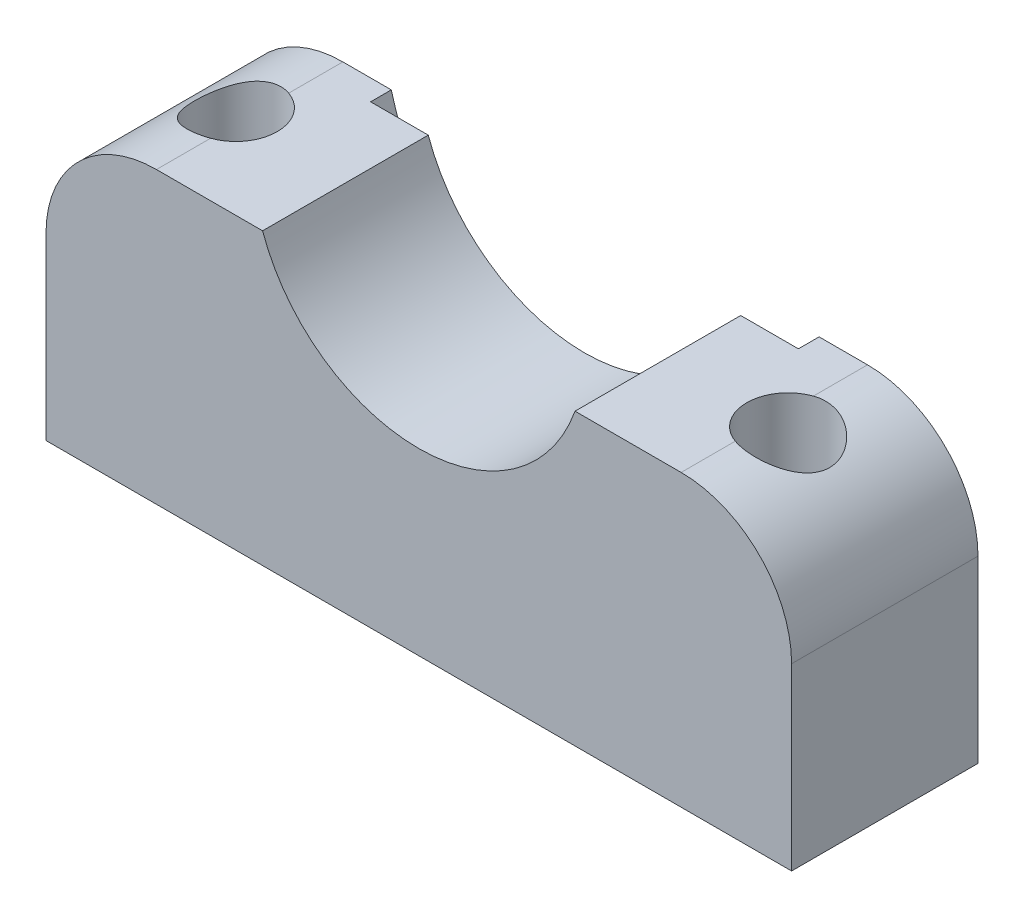
ISO-10303-21;
HEADER;
FILE_DESCRIPTION(('STEP AP214'),'2;1');
FILE_NAME('part.step','',(''),(''),'','','');
FILE_SCHEMA(('AUTOMOTIVE_DESIGN { 1 0 10303 214 1 1 1 1 }'));
ENDSEC;
DATA;
#1=APPLICATION_CONTEXT('core data for automotive mechanical design processes');
#2=APPLICATION_PROTOCOL_DEFINITION('international standard','automotive_design',2000,#1);
#3=PRODUCT_CONTEXT('',#1,'mechanical');
#4=PRODUCT('Part','Part','',(#3));
#5=PRODUCT_RELATED_PRODUCT_CATEGORY('part','',(#4));
#6=PRODUCT_DEFINITION_FORMATION('','',#4);
#7=PRODUCT_DEFINITION_CONTEXT('part definition',#1,'design');
#8=PRODUCT_DEFINITION('design','',#6,#7);
#9=PRODUCT_DEFINITION_SHAPE('','',#8);
#10=(LENGTH_UNIT() NAMED_UNIT(*) SI_UNIT(.MILLI.,.METRE.));
#11=(NAMED_UNIT(*) PLANE_ANGLE_UNIT() SI_UNIT($,.RADIAN.));
#12=(NAMED_UNIT(*) SI_UNIT($,.STERADIAN.) SOLID_ANGLE_UNIT());
#13=UNCERTAINTY_MEASURE_WITH_UNIT(LENGTH_MEASURE(1.E-05),#10,'distance_accuracy_value','');
#14=(GEOMETRIC_REPRESENTATION_CONTEXT(3) GLOBAL_UNCERTAINTY_ASSIGNED_CONTEXT((#13)) GLOBAL_UNIT_ASSIGNED_CONTEXT((#10,
#11,#12)) REPRESENTATION_CONTEXT('',''));
#15=CARTESIAN_POINT('',(0.,0.,0.));
#16=DIRECTION('',(0.,0.,1.));
#17=DIRECTION('',(1.,0.,0.));
#18=AXIS2_PLACEMENT_3D('',#15,#16,#17);
#19=CARTESIAN_POINT('',(-13.5,12.5,6.75));
#20=DIRECTION('',(0.,0.,-1.));
#21=DIRECTION('',(-1.,0.,0.));
#22=AXIS2_PLACEMENT_3D('',#19,#20,#21);
#23=CYLINDRICAL_SURFACE('',#22,6.);
#24=DIRECTION('',(0.,0.,-1.));
#25=VECTOR('',#24,1.);
#26=CARTESIAN_POINT('',(-19.1568542494924,10.5,6.75));
#27=LINE('',#26,#25);
#28=CARTESIAN_POINT('',(-19.1568542494924,10.5,6.75));
#29=VERTEX_POINT('',#28);
#30=CARTESIAN_POINT('',(-19.1568542494924,10.5,0.75));
#31=VERTEX_POINT('',#30);
#32=EDGE_CURVE('E131',#29,#31,#27,.T.);
#33=ORIENTED_EDGE('',*,*,#32,.F.);
#34=CARTESIAN_POINT('',(-13.5,12.5,6.75));
#35=DIRECTION('',(0.,0.,1.));
#36=DIRECTION('',(1.,0.,0.));
#37=AXIS2_PLACEMENT_3D('',#34,#35,#36);
#38=CIRCLE('',#37,6.);
#39=CARTESIAN_POINT('',(-7.84314575050762,10.5,6.75));
#40=VERTEX_POINT('',#39);
#41=EDGE_CURVE('E146',#29,#40,#38,.T.);
#42=ORIENTED_EDGE('',*,*,#41,.T.);
#43=DIRECTION('',(0.,0.,-1.));
#44=VECTOR('',#43,1.);
#45=CARTESIAN_POINT('',(-7.84314575050762,10.5,6.75));
#46=LINE('',#45,#44);
#47=CARTESIAN_POINT('',(-7.84314575050762,10.5,0.75));
#48=VERTEX_POINT('',#47);
#49=EDGE_CURVE('E356',#48,#40,#46,.F.);
#50=ORIENTED_EDGE('',*,*,#49,.F.);
#51=CARTESIAN_POINT('',(-13.5,12.5,0.75));
#52=DIRECTION('',(0.,0.,-1.));
#53=DIRECTION('',(-1.,0.,0.));
#54=AXIS2_PLACEMENT_3D('',#51,#52,#53);
#55=CIRCLE('',#54,6.);
#56=EDGE_CURVE('E148',#48,#31,#55,.T.);
#57=ORIENTED_EDGE('',*,*,#56,.T.);
#58=EDGE_LOOP('',(#33,#42,#50,#57));
#59=FACE_BOUND('',#58,.T.);
#60=ADVANCED_FACE('F35',(#59),#23,.F.);
#61=CARTESIAN_POINT('',(-27.,0.,6.75));
#62=DIRECTION('',(-1.,0.,0.));
#63=DIRECTION('',(0.,-1.,0.));
#64=AXIS2_PLACEMENT_3D('',#61,#62,#63);
#65=PLANE('',#64);
#66=DIRECTION('',(0.,1.,0.));
#67=VECTOR('',#66,1.);
#68=CARTESIAN_POINT('',(-27.,0.,6.75));
#69=LINE('',#68,#67);
#70=CARTESIAN_POINT('',(-27.,0.,6.75));
#71=VERTEX_POINT('',#70);
#72=CARTESIAN_POINT('',(-27.,6.5,6.75));
#73=VERTEX_POINT('',#72);
#74=EDGE_CURVE('E154',#71,#73,#69,.T.);
#75=ORIENTED_EDGE('',*,*,#74,.T.);
#76=DIRECTION('',(0.,0.,1.));
#77=VECTOR('',#76,1.);
#78=CARTESIAN_POINT('',(-27.,6.5,0.));
#79=LINE('',#78,#77);
#80=CARTESIAN_POINT('',(-27.,6.5,0.));
#81=VERTEX_POINT('',#80);
#82=EDGE_CURVE('E351',#73,#81,#79,.F.);
#83=ORIENTED_EDGE('',*,*,#82,.T.);
#84=DIRECTION('',(0.,1.,0.));
#85=VECTOR('',#84,1.);
#86=CARTESIAN_POINT('',(-27.,0.,0.));
#87=LINE('',#86,#85);
#88=CARTESIAN_POINT('',(-27.,0.,0.));
#89=VERTEX_POINT('',#88);
#90=EDGE_CURVE('E172',#89,#81,#87,.T.);
#91=ORIENTED_EDGE('',*,*,#90,.F.);
#92=DIRECTION('',(0.,0.,-1.));
#93=VECTOR('',#92,1.);
#94=CARTESIAN_POINT('',(-27.,0.,6.75));
#95=LINE('',#94,#93);
#96=EDGE_CURVE('E178',#71,#89,#95,.T.);
#97=ORIENTED_EDGE('',*,*,#96,.F.);
#98=EDGE_LOOP('',(#75,#83,#91,#97));
#99=FACE_BOUND('',#98,.T.);
#100=ADVANCED_FACE('F243',(#99),#65,.T.);
#101=CARTESIAN_POINT('',(0.,0.,6.75));
#102=DIRECTION('',(0.,-1.,0.));
#103=DIRECTION('',(1.,0.,0.));
#104=AXIS2_PLACEMENT_3D('',#101,#102,#103);
#105=PLANE('',#104);
#106=CARTESIAN_POINT('',(-23.5,0.,3.375));
#107=DIRECTION('',(0.,-1.,0.));
#108=DIRECTION('',(1.,0.,0.));
#109=AXIS2_PLACEMENT_3D('',#106,#107,#108);
#110=CIRCLE('',#109,1.5);
#111=CARTESIAN_POINT('',(-22.,0.,3.375));
#112=VERTEX_POINT('',#111);
#113=EDGE_CURVE('E192',#112,#112,#110,.T.);
#114=ORIENTED_EDGE('',*,*,#113,.F.);
#115=EDGE_LOOP('',(#114));
#116=FACE_BOUND('',#115,.T.);
#117=CARTESIAN_POINT('',(-3.5,0.,3.375));
#118=DIRECTION('',(0.,-1.,0.));
#119=DIRECTION('',(1.,0.,0.));
#120=AXIS2_PLACEMENT_3D('',#117,#118,#119);
#121=CIRCLE('',#120,1.5);
#122=CARTESIAN_POINT('',(-2.,0.,3.375));
#123=VERTEX_POINT('',#122);
#124=EDGE_CURVE('E359',#123,#123,#121,.T.);
#125=ORIENTED_EDGE('',*,*,#124,.F.);
#126=EDGE_LOOP('',(#125));
#127=FACE_BOUND('',#126,.T.);
#128=DIRECTION('',(-1.,0.,0.));
#129=VECTOR('',#128,1.);
#130=CARTESIAN_POINT('',(0.,0.,0.));
#131=LINE('',#130,#129);
#132=CARTESIAN_POINT('',(0.,0.,0.));
#133=VERTEX_POINT('',#132);
#134=EDGE_CURVE('E161',#133,#89,#131,.T.);
#135=ORIENTED_EDGE('',*,*,#134,.F.);
#136=DIRECTION('',(0.,0.,-1.));
#137=VECTOR('',#136,1.);
#138=CARTESIAN_POINT('',(0.,0.,6.75));
#139=LINE('',#138,#137);
#140=CARTESIAN_POINT('',(0.,0.,6.75));
#141=VERTEX_POINT('',#140);
#142=EDGE_CURVE('E171',#141,#133,#139,.T.);
#143=ORIENTED_EDGE('',*,*,#142,.F.);
#144=DIRECTION('',(-1.,0.,0.));
#145=VECTOR('',#144,1.);
#146=CARTESIAN_POINT('',(0.,0.,6.75));
#147=LINE('',#146,#145);
#148=EDGE_CURVE('E158',#141,#71,#147,.T.);
#149=ORIENTED_EDGE('',*,*,#148,.T.);
#150=ORIENTED_EDGE('',*,*,#96,.T.);
#151=EDGE_LOOP('',(#135,#143,#149,#150));
#152=FACE_BOUND('',#151,.T.);
#153=ADVANCED_FACE('F239',(#116,#127,#152),#105,.T.);
#154=CARTESIAN_POINT('',(0.,0.,6.75));
#155=DIRECTION('',(-1.,0.,0.));
#156=DIRECTION('',(0.,0.,1.));
#157=AXIS2_PLACEMENT_3D('',#154,#155,#156);
#158=PLANE('',#157);
#159=DIRECTION('',(0.,1.,0.));
#160=VECTOR('',#159,1.);
#161=CARTESIAN_POINT('',(0.,0.,0.));
#162=LINE('',#161,#160);
#163=CARTESIAN_POINT('',(0.,6.5,0.));
#164=VERTEX_POINT('',#163);
#165=EDGE_CURVE('E155',#133,#164,#162,.T.);
#166=ORIENTED_EDGE('',*,*,#165,.T.);
#167=DIRECTION('',(0.,0.,1.));
#168=VECTOR('',#167,1.);
#169=CARTESIAN_POINT('',(0.,6.5,6.75));
#170=LINE('',#169,#168);
#171=CARTESIAN_POINT('',(0.,6.5,6.75));
#172=VERTEX_POINT('',#171);
#173=EDGE_CURVE('E343',#164,#172,#170,.T.);
#174=ORIENTED_EDGE('',*,*,#173,.T.);
#175=DIRECTION('',(0.,1.,0.));
#176=VECTOR('',#175,1.);
#177=CARTESIAN_POINT('',(0.,0.,6.75));
#178=LINE('',#177,#176);
#179=EDGE_CURVE('E168',#141,#172,#178,.T.);
#180=ORIENTED_EDGE('',*,*,#179,.F.);
#181=ORIENTED_EDGE('',*,*,#142,.T.);
#182=EDGE_LOOP('',(#166,#174,#180,#181));
#183=FACE_BOUND('',#182,.T.);
#184=ADVANCED_FACE('F233',(#183),#158,.F.);
#185=CARTESIAN_POINT('',(0.,0.,6.75));
#186=DIRECTION('',(0.,0.,1.));
#187=DIRECTION('',(1.,0.,0.));
#188=AXIS2_PLACEMENT_3D('',#185,#186,#187);
#189=PLANE('',#188);
#190=DIRECTION('',(1.,0.,0.));
#191=VECTOR('',#190,1.);
#192=CARTESIAN_POINT('',(0.,10.5,6.75));
#193=LINE('',#192,#191);
#194=CARTESIAN_POINT('',(-23.,10.5,6.75));
#195=VERTEX_POINT('',#194);
#196=EDGE_CURVE('E127',#195,#29,#193,.T.);
#197=ORIENTED_EDGE('',*,*,#196,.F.);
#198=CARTESIAN_POINT('',(-23.,6.5,6.75));
#199=DIRECTION('',(0.,0.,1.));
#200=DIRECTION('',(1.,0.,0.));
#201=AXIS2_PLACEMENT_3D('',#198,#199,#200);
#202=CIRCLE('',#201,4.);
#203=EDGE_CURVE('E352',#195,#73,#202,.T.);
#204=ORIENTED_EDGE('',*,*,#203,.T.);
#205=ORIENTED_EDGE('',*,*,#74,.F.);
#206=ORIENTED_EDGE('',*,*,#148,.F.);
#207=ORIENTED_EDGE('',*,*,#179,.T.);
#208=CARTESIAN_POINT('',(-4.,6.5,6.75));
#209=DIRECTION('',(0.,0.,1.));
#210=DIRECTION('',(1.,0.,0.));
#211=AXIS2_PLACEMENT_3D('',#208,#209,#210);
#212=CIRCLE('',#211,4.);
#213=CARTESIAN_POINT('',(-4.,10.5,6.75));
#214=VERTEX_POINT('',#213);
#215=EDGE_CURVE('E205',#172,#214,#212,.T.);
#216=ORIENTED_EDGE('',*,*,#215,.T.);
#217=EDGE_CURVE('E140',#40,#214,#193,.T.);
#218=ORIENTED_EDGE('',*,*,#217,.F.);
#219=ORIENTED_EDGE('',*,*,#41,.F.);
#220=EDGE_LOOP('',(#197,#204,#205,#206,#207,#216,#218,#219));
#221=FACE_BOUND('',#220,.T.);
#222=ADVANCED_FACE('F153',(#221),#189,.T.);
#223=CARTESIAN_POINT('',(0.,0.,0.));
#224=DIRECTION('',(0.,0.,1.));
#225=DIRECTION('',(1.,0.,0.));
#226=AXIS2_PLACEMENT_3D('',#223,#224,#225);
#227=PLANE('',#226);
#228=ORIENTED_EDGE('',*,*,#90,.T.);
#229=CARTESIAN_POINT('',(-23.,6.5,0.));
#230=DIRECTION('',(0.,0.,1.));
#231=DIRECTION('',(1.,0.,0.));
#232=AXIS2_PLACEMENT_3D('',#229,#230,#231);
#233=CIRCLE('',#232,4.);
#234=CARTESIAN_POINT('',(-23.,10.5,0.));
#235=VERTEX_POINT('',#234);
#236=EDGE_CURVE('E346',#81,#235,#233,.F.);
#237=ORIENTED_EDGE('',*,*,#236,.T.);
#238=DIRECTION('',(1.,0.,0.));
#239=VECTOR('',#238,1.);
#240=CARTESIAN_POINT('',(0.,10.5,0.));
#241=LINE('',#240,#239);
#242=CARTESIAN_POINT('',(-21.2459666924148,10.5,0.));
#243=VERTEX_POINT('',#242);
#244=EDGE_CURVE('E150',#235,#243,#241,.T.);
#245=ORIENTED_EDGE('',*,*,#244,.T.);
#246=CARTESIAN_POINT('',(-13.5,12.5,0.));
#247=DIRECTION('',(0.,0.,1.));
#248=DIRECTION('',(1.,0.,0.));
#249=AXIS2_PLACEMENT_3D('',#246,#247,#248);
#250=CIRCLE('',#249,8.);
#251=CARTESIAN_POINT('',(-5.75403330758517,10.5,0.));
#252=VERTEX_POINT('',#251);
#253=EDGE_CURVE('E180',#243,#252,#250,.T.);
#254=ORIENTED_EDGE('',*,*,#253,.T.);
#255=CARTESIAN_POINT('',(-4.,10.5,0.));
#256=VERTEX_POINT('',#255);
#257=EDGE_CURVE('E362',#252,#256,#241,.T.);
#258=ORIENTED_EDGE('',*,*,#257,.T.);
#259=CARTESIAN_POINT('',(-4.,6.5,0.));
#260=DIRECTION('',(0.,0.,1.));
#261=DIRECTION('',(1.,0.,0.));
#262=AXIS2_PLACEMENT_3D('',#259,#260,#261);
#263=CIRCLE('',#262,4.);
#264=EDGE_CURVE('E341',#256,#164,#263,.F.);
#265=ORIENTED_EDGE('',*,*,#264,.T.);
#266=ORIENTED_EDGE('',*,*,#165,.F.);
#267=ORIENTED_EDGE('',*,*,#134,.T.);
#268=EDGE_LOOP('',(#228,#237,#245,#254,#258,#265,#266,#267));
#269=FACE_BOUND('',#268,.T.);
#270=ADVANCED_FACE('F226',(#269),#227,.F.);
#271=CARTESIAN_POINT('',(-13.5,12.5,0.75));
#272=DIRECTION('',(0.,0.,-1.));
#273=DIRECTION('',(-1.,0.,0.));
#274=AXIS2_PLACEMENT_3D('',#271,#272,#273);
#275=PLANE('',#274);
#276=DIRECTION('',(-1.,0.,0.));
#277=VECTOR('',#276,1.);
#278=CARTESIAN_POINT('',(-13.5,10.5,0.75));
#279=LINE('',#278,#277);
#280=CARTESIAN_POINT('',(-5.75403330758517,10.5,0.75));
#281=VERTEX_POINT('',#280);
#282=EDGE_CURVE('E139',#281,#48,#279,.T.);
#283=ORIENTED_EDGE('',*,*,#282,.F.);
#284=CARTESIAN_POINT('',(-13.5,12.5,0.75));
#285=DIRECTION('',(0.,0.,-1.));
#286=DIRECTION('',(-1.,0.,0.));
#287=AXIS2_PLACEMENT_3D('',#284,#285,#286);
#288=CIRCLE('',#287,8.);
#289=CARTESIAN_POINT('',(-21.2459666924148,10.5,0.75));
#290=VERTEX_POINT('',#289);
#291=EDGE_CURVE('E149',#281,#290,#288,.T.);
#292=ORIENTED_EDGE('',*,*,#291,.T.);
#293=EDGE_CURVE('E363',#31,#290,#279,.T.);
#294=ORIENTED_EDGE('',*,*,#293,.F.);
#295=ORIENTED_EDGE('',*,*,#56,.F.);
#296=EDGE_LOOP('',(#283,#292,#294,#295));
#297=FACE_BOUND('',#296,.T.);
#298=ADVANCED_FACE('F223',(#297),#275,.T.);
#299=CARTESIAN_POINT('',(-13.5,12.5,0.75));
#300=DIRECTION('',(0.,0.,-1.));
#301=DIRECTION('',(-1.,0.,0.));
#302=AXIS2_PLACEMENT_3D('',#299,#300,#301);
#303=CYLINDRICAL_SURFACE('',#302,8.);
#304=ORIENTED_EDGE('',*,*,#253,.F.);
#305=DIRECTION('',(0.,0.,-1.));
#306=VECTOR('',#305,1.);
#307=CARTESIAN_POINT('',(-21.2459666924148,10.5,0.75));
#308=LINE('',#307,#306);
#309=EDGE_CURVE('E186',#243,#290,#308,.F.);
#310=ORIENTED_EDGE('',*,*,#309,.T.);
#311=ORIENTED_EDGE('',*,*,#291,.F.);
#312=DIRECTION('',(0.,0.,-1.));
#313=VECTOR('',#312,1.);
#314=CARTESIAN_POINT('',(-5.75403330758517,10.5,0.75));
#315=LINE('',#314,#313);
#316=EDGE_CURVE('E183',#281,#252,#315,.T.);
#317=ORIENTED_EDGE('',*,*,#316,.T.);
#318=EDGE_LOOP('',(#304,#310,#311,#317));
#319=FACE_BOUND('',#318,.T.);
#320=ADVANCED_FACE('F222',(#319),#303,.F.);
#321=CARTESIAN_POINT('',(0.,10.5,-2.25));
#322=DIRECTION('',(0.,-1.,0.));
#323=DIRECTION('',(1.,0.,0.));
#324=AXIS2_PLACEMENT_3D('',#321,#322,#323);
#325=PLANE('',#324);
#326=ORIENTED_EDGE('',*,*,#217,.T.);
#327=DIRECTION('',(0.,0.,1.));
#328=VECTOR('',#327,1.);
#329=CARTESIAN_POINT('',(-4.,10.5,-2.25));
#330=LINE('',#329,#328);
#331=CARTESIAN_POINT('',(-4.,10.5,4.7892135623731));
#332=VERTEX_POINT('',#331);
#333=EDGE_CURVE('E49',#214,#332,#330,.F.);
#334=ORIENTED_EDGE('',*,*,#333,.T.);
#335=CARTESIAN_POINT('',(-3.5,10.5,3.375));
#336=DIRECTION('',(0.,-1.,0.));
#337=DIRECTION('',(1.,0.,0.));
#338=AXIS2_PLACEMENT_3D('',#335,#336,#337);
#339=CIRCLE('',#338,1.5);
#340=CARTESIAN_POINT('',(-4.,10.5,1.9607864376269));
#341=VERTEX_POINT('',#340);
#342=EDGE_CURVE('E191',#332,#341,#339,.T.);
#343=ORIENTED_EDGE('',*,*,#342,.T.);
#344=DIRECTION('',(0.,0.,1.));
#345=VECTOR('',#344,1.);
#346=CARTESIAN_POINT('',(-4.,10.5,-2.25));
#347=LINE('',#346,#345);
#348=EDGE_CURVE('E339',#341,#256,#347,.F.);
#349=ORIENTED_EDGE('',*,*,#348,.T.);
#350=ORIENTED_EDGE('',*,*,#257,.F.);
#351=ORIENTED_EDGE('',*,*,#316,.F.);
#352=ORIENTED_EDGE('',*,*,#282,.T.);
#353=ORIENTED_EDGE('',*,*,#49,.T.);
#354=EDGE_LOOP('',(#326,#334,#343,#349,#350,#351,#352,#353));
#355=FACE_BOUND('',#354,.T.);
#356=ADVANCED_FACE('F219',(#355),#325,.F.);
#357=ORIENTED_EDGE('',*,*,#244,.F.);
#358=DIRECTION('',(0.,0.,1.));
#359=VECTOR('',#358,1.);
#360=CARTESIAN_POINT('',(-23.,10.5,6.75));
#361=LINE('',#360,#359);
#362=CARTESIAN_POINT('',(-23.,10.5,1.9607864376269));
#363=VERTEX_POINT('',#362);
#364=EDGE_CURVE('E195',#235,#363,#361,.T.);
#365=ORIENTED_EDGE('',*,*,#364,.T.);
#366=CARTESIAN_POINT('',(-23.5,10.5,3.375));
#367=DIRECTION('',(0.,-1.,0.));
#368=DIRECTION('',(1.,0.,0.));
#369=AXIS2_PLACEMENT_3D('',#366,#367,#368);
#370=CIRCLE('',#369,1.5);
#371=CARTESIAN_POINT('',(-23.,10.5,4.7892135623731));
#372=VERTEX_POINT('',#371);
#373=EDGE_CURVE('E189',#363,#372,#370,.T.);
#374=ORIENTED_EDGE('',*,*,#373,.T.);
#375=DIRECTION('',(0.,0.,1.));
#376=VECTOR('',#375,1.);
#377=CARTESIAN_POINT('',(-23.,10.5,6.75));
#378=LINE('',#377,#376);
#379=EDGE_CURVE('E135',#372,#195,#378,.T.);
#380=ORIENTED_EDGE('',*,*,#379,.T.);
#381=ORIENTED_EDGE('',*,*,#196,.T.);
#382=ORIENTED_EDGE('',*,*,#32,.T.);
#383=ORIENTED_EDGE('',*,*,#293,.T.);
#384=ORIENTED_EDGE('',*,*,#309,.F.);
#385=EDGE_LOOP('',(#357,#365,#374,#380,#381,#382,#383,#384));
#386=FACE_BOUND('',#385,.T.);
#387=ADVANCED_FACE('F130',(#386),#325,.F.);
#388=CARTESIAN_POINT('',(-23.5,16.,3.375));
#389=DIRECTION('',(0.,-1.,0.));
#390=DIRECTION('',(1.,0.,0.));
#391=AXIS2_PLACEMENT_3D('',#388,#389,#390);
#392=CYLINDRICAL_SURFACE('',#391,1.5);
#393=ORIENTED_EDGE('',*,*,#113,.T.);
#394=EDGE_LOOP('',(#393));
#395=FACE_BOUND('',#394,.T.);
#396=ORIENTED_EDGE('',*,*,#373,.F.);
#397=CARTESIAN_POINT('',(-23.,10.5,1.9607864376269));
#398=CARTESIAN_POINT('',(-23.0378319832155,10.5000023960205,1.94740987708835));
#399=CARTESIAN_POINT('',(-23.0761849195276,10.499462492245,1.93556013709208));
#400=CARTESIAN_POINT('',(-23.1536817238485,10.4972344087846,1.91497532391856));
#401=CARTESIAN_POINT('',(-23.192825532563,10.4955463148754,1.90624001815115));
#402=CARTESIAN_POINT('',(-23.3107978699076,10.488680291099,1.88484496217661));
#403=CARTESIAN_POINT('',(-23.3904372503122,10.4817015033505,1.87690110022407));
#404=CARTESIAN_POINT('',(-23.5493703017306,10.4629043254003,1.87370281438772));
#405=CARTESIAN_POINT('',(-23.6286638531235,10.4510843770191,1.87845247877367));
#406=CARTESIAN_POINT('',(-23.7847678210828,10.4230638884984,1.90017170215322));
#407=CARTESIAN_POINT('',(-23.861577618519,10.4068622654118,1.91714428381276));
#408=CARTESIAN_POINT('',(-24.0125704522464,10.3705134072633,1.96303541805386));
#409=CARTESIAN_POINT('',(-24.0866521271973,10.3502838310809,1.99222031720811));
#410=CARTESIAN_POINT('',(-24.2287327725192,10.3073262905761,2.06152995930019));
#411=CARTESIAN_POINT('',(-24.296728715158,10.2845970950551,2.10166010790208));
#412=CARTESIAN_POINT('',(-24.4304479248761,10.2362098079906,2.19540304086512));
#413=CARTESIAN_POINT('',(-24.4955694217961,10.2104620785071,2.24982932821593));
#414=CARTESIAN_POINT('',(-24.6159030232071,10.1596626989638,2.36904793505705));
#415=CARTESIAN_POINT('',(-24.6711099935825,10.1346114151922,2.43384559257655));
#416=CARTESIAN_POINT('',(-24.7719977489546,10.0865389971983,2.57511048985045));
#417=CARTESIAN_POINT('',(-24.8172588530828,10.063624889974,2.65191653550681));
#418=CARTESIAN_POINT('',(-24.8938316823481,10.023533003501,2.81356482147389));
#419=CARTESIAN_POINT('',(-24.9251569081314,10.006349676509,2.89839918712523));
#420=CARTESIAN_POINT('',(-24.9701252792281,9.98126657535987,3.06585004545837));
#421=CARTESIAN_POINT('',(-24.9850765675282,9.97268564133896,3.14801026583185));
#422=CARTESIAN_POINT('',(-25.0010769629969,9.9634934230368,3.31408850740847));
#423=CARTESIAN_POINT('',(-25.0021378387065,9.96287539225651,3.39800498024862));
#424=CARTESIAN_POINT('',(-24.9909911514778,9.96929056969859,3.55512834424229));
#425=CARTESIAN_POINT('',(-24.9802568146482,9.97547432156045,3.62848176935523));
#426=CARTESIAN_POINT('',(-24.9483390224926,9.99346639855836,3.77215363037803));
#427=CARTESIAN_POINT('',(-24.9271531784361,10.0052760094839,3.84247136847306));
#428=CARTESIAN_POINT('',(-24.8745552423506,10.0336879238743,3.98011111223491));
#429=CARTESIAN_POINT('',(-24.8429100595446,10.0503983871593,4.04732081146079));
#430=CARTESIAN_POINT('',(-24.7705558886852,10.0870285889435,4.17570184338351));
#431=CARTESIAN_POINT('',(-24.7298433758413,10.1069495746513,4.23687081445269));
#432=CARTESIAN_POINT('',(-24.6348352310969,10.1510785750847,4.35930737791359));
#433=CARTESIAN_POINT('',(-24.5794891704797,10.1755132196991,4.41967958773666));
#434=CARTESIAN_POINT('',(-24.4597897519909,10.2246748613,4.53062527354508));
#435=CARTESIAN_POINT('',(-24.3954309719051,10.2494020260118,4.58119280686449));
#436=CARTESIAN_POINT('',(-24.2538055866462,10.2992120080795,4.67481115954185));
#437=CARTESIAN_POINT('',(-24.1759322765211,10.3241817499288,4.71701081688022));
#438=CARTESIAN_POINT('',(-24.0130624339363,10.3705113673106,4.78731152903659));
#439=CARTESIAN_POINT('',(-23.9280686201886,10.3918726113078,4.81541793648843));
#440=CARTESIAN_POINT('',(-23.756889687431,10.4286726742671,4.85534314738412));
#441=CARTESIAN_POINT('',(-23.670892838456,10.4443166304953,4.8677765564159));
#442=CARTESIAN_POINT('',(-23.4972288411973,10.4699421337877,4.8775089299154));
#443=CARTESIAN_POINT('',(-23.4095634067551,10.4799291977032,4.87482266782157));
#444=CARTESIAN_POINT('',(-23.2677801223683,10.4914082642857,4.85794847935411));
#445=CARTESIAN_POINT('',(-23.213212157416,10.4946748182471,4.84836710906705));
#446=CARTESIAN_POINT('',(-23.1054283695219,10.4989769250386,4.82323335287173));
#447=CARTESIAN_POINT('',(-23.0522114231144,10.5000143958501,4.80768611379546));
#448=CARTESIAN_POINT('',(-23.,10.5,4.7892135623731));
#449=B_SPLINE_CURVE_WITH_KNOTS('',3,(#397,#398,#399,#400,#401,#402,#403,#404,#405,#406,#407,
#408,#409,#410,#411,#412,#413,#414,#415,#416,#417,#418,#419,#420,#421,#422,#423,#424,#425,#426,
#427,#428,#429,#430,#431,#432,#433,#434,#435,#436,#437,#438,#439,#440,#441,#442,#443,#444,#445,
#446,#447,#448),.UNSPECIFIED.,.F.,.F.,(4,2,2,2,2,2,2,2,2,2,2,2,2,2,2,2,2,2,2,2,2,2,2,2,2,4),(0.,
0.120309329345876,0.240609671945858,0.480363075352819,0.720193706685026,0.960083667300783,
1.20550329603895,1.45104435334003,1.71594286488899,1.98097815779878,2.25565644398619,
2.53006804781032,2.78045075843437,3.03062132056753,3.25276378324799,3.47495704094256,
3.70247965257162,3.93009086511286,4.18542417425257,4.44091176176855,4.71561106476723,
4.99020595745394,5.25365899583674,5.51685465883552,5.68299597047867,5.84899427095039),.UNSPECIFIED.);
#450=EDGE_CURVE('E198',#363,#372,#449,.T.);
#451=ORIENTED_EDGE('',*,*,#450,.T.);
#452=EDGE_LOOP('',(#396,#451));
#453=FACE_BOUND('',#452,.T.);
#454=ADVANCED_FACE('F210',(#395,#453),#392,.F.);
#455=CARTESIAN_POINT('',(-3.5,16.,3.375));
#456=DIRECTION('',(0.,-1.,0.));
#457=DIRECTION('',(1.,0.,0.));
#458=AXIS2_PLACEMENT_3D('',#455,#456,#457);
#459=CYLINDRICAL_SURFACE('',#458,1.5);
#460=ORIENTED_EDGE('',*,*,#124,.T.);
#461=EDGE_LOOP('',(#460));
#462=FACE_BOUND('',#461,.T.);
#463=ORIENTED_EDGE('',*,*,#342,.F.);
#464=CARTESIAN_POINT('',(-4.,10.5,4.7892135623731));
#465=CARTESIAN_POINT('',(-3.96216801678447,10.5000023960205,4.80259012291165));
#466=CARTESIAN_POINT('',(-3.92381508047237,10.4994624922451,4.81443986290792));
#467=CARTESIAN_POINT('',(-3.84631827615155,10.4972344087846,4.83502467608144));
#468=CARTESIAN_POINT('',(-3.80717446743704,10.4955463148754,4.84375998184885));
#469=CARTESIAN_POINT('',(-3.68920213009239,10.488680291099,4.86515503782339));
#470=CARTESIAN_POINT('',(-3.60956274968784,10.4817015033505,4.87309889977593));
#471=CARTESIAN_POINT('',(-3.45062969826937,10.4629043254003,4.87629718561228));
#472=CARTESIAN_POINT('',(-3.37133614687646,10.4510843770191,4.87154752122633));
#473=CARTESIAN_POINT('',(-3.21523217891716,10.4230638884984,4.84982829784678));
#474=CARTESIAN_POINT('',(-3.138422381481,10.4068622654118,4.83285571618724));
#475=CARTESIAN_POINT('',(-2.98742954775357,10.3705134072633,4.78696458194615));
#476=CARTESIAN_POINT('',(-2.91334787280273,10.3502838310809,4.75777968279189));
#477=CARTESIAN_POINT('',(-2.77126722748079,10.3073262905761,4.68847004069982));
#478=CARTESIAN_POINT('',(-2.70327128484197,10.2845970950551,4.64833989209792));
#479=CARTESIAN_POINT('',(-2.56955207512394,10.2362098079906,4.55459695913488));
#480=CARTESIAN_POINT('',(-2.50443057820388,10.2104620785071,4.50017067178408));
#481=CARTESIAN_POINT('',(-2.38409697679291,10.1596626989638,4.38095206494295));
#482=CARTESIAN_POINT('',(-2.32889000641751,10.1346114151922,4.31615440742345));
#483=CARTESIAN_POINT('',(-2.22800225104545,10.0865389971983,4.17488951014955));
#484=CARTESIAN_POINT('',(-2.18274114691722,10.0636248899741,4.09808346449319));
#485=CARTESIAN_POINT('',(-2.10616831765192,10.023533003501,3.93643517852611));
#486=CARTESIAN_POINT('',(-2.07484309186856,10.006349676509,3.85160081287477));
#487=CARTESIAN_POINT('',(-2.02987472077193,9.98126657535987,3.68414995454163));
#488=CARTESIAN_POINT('',(-2.01492343247182,9.97268564133896,3.60198973416815));
#489=CARTESIAN_POINT('',(-1.99892303700314,9.9634934230368,3.43591149259154));
#490=CARTESIAN_POINT('',(-1.99786216129351,9.96287539225651,3.35199501975138));
#491=CARTESIAN_POINT('',(-2.00900884852218,9.96929056969859,3.19487165575771));
#492=CARTESIAN_POINT('',(-2.01974318535176,9.97547432156045,3.12151823064477));
#493=CARTESIAN_POINT('',(-2.05166097750742,9.99346639855836,2.97784636962197));
#494=CARTESIAN_POINT('',(-2.07284682156386,10.005276009484,2.90752863152695));
#495=CARTESIAN_POINT('',(-2.12544475764938,10.0336879238743,2.7698888877651));
#496=CARTESIAN_POINT('',(-2.15708994045544,10.0503983871593,2.70267918853921));
#497=CARTESIAN_POINT('',(-2.22944411131478,10.0870285889435,2.57429815661649));
#498=CARTESIAN_POINT('',(-2.2701566241587,10.1069495746513,2.51312918554731));
#499=CARTESIAN_POINT('',(-2.36516476890307,10.1510785750847,2.39069262208641));
#500=CARTESIAN_POINT('',(-2.4205108295203,10.1755132196991,2.33032041226334));
#501=CARTESIAN_POINT('',(-2.54021024800909,10.2246748613,2.21937472645492));
#502=CARTESIAN_POINT('',(-2.60456902809491,10.2494020260118,2.16880719313551));
#503=CARTESIAN_POINT('',(-2.74619441335377,10.2992120080795,2.07518884045815));
#504=CARTESIAN_POINT('',(-2.82406772347893,10.3241817499288,2.03298918311978));
#505=CARTESIAN_POINT('',(-2.98693756606374,10.3705113673106,1.96268847096341));
#506=CARTESIAN_POINT('',(-3.0719313798114,10.3918726113078,1.93458206351157));
#507=CARTESIAN_POINT('',(-3.24311031256902,10.4286726742671,1.89465685261588));
#508=CARTESIAN_POINT('',(-3.32910716154398,10.4443166304953,1.8822234435841));
#509=CARTESIAN_POINT('',(-3.50277115880275,10.4699421337877,1.87249107008461));
#510=CARTESIAN_POINT('',(-3.59043659324487,10.4799291977032,1.87517733217843));
#511=CARTESIAN_POINT('',(-3.7322198776317,10.4914082642857,1.89205152064589));
#512=CARTESIAN_POINT('',(-3.78678784258395,10.4946748182471,1.90163289093295));
#513=CARTESIAN_POINT('',(-3.89457163047814,10.4989769250386,1.92676664712827));
#514=CARTESIAN_POINT('',(-3.94778857688557,10.5000143958501,1.94231388620455));
#515=CARTESIAN_POINT('',(-4.,10.5,1.9607864376269));
#516=B_SPLINE_CURVE_WITH_KNOTS('',3,(#464,#465,#466,#467,#468,#469,#470,#471,#472,#473,#474,
#475,#476,#477,#478,#479,#480,#481,#482,#483,#484,#485,#486,#487,#488,#489,#490,#491,#492,#493,
#494,#495,#496,#497,#498,#499,#500,#501,#502,#503,#504,#505,#506,#507,#508,#509,#510,#511,#512,
#513,#514,#515),.UNSPECIFIED.,.F.,.F.,(4,2,2,2,2,2,2,2,2,2,2,2,2,2,2,2,2,2,2,2,2,2,2,2,2,4),(0.,
0.120309329345877,0.240609671945858,0.480363075352819,0.720193706685023,0.960083667300781,
1.20550329603895,1.45104435334003,1.71594286488898,1.98097815779877,2.25565644398618,
2.53006804781032,2.78045075843437,3.03062132056753,3.25276378324799,3.47495704094256,
3.70247965257162,3.93009086511286,4.18542417425256,4.44091176176856,4.71561106476723,
4.99020595745394,5.25365899583673,5.51685465883552,5.68299597047867,5.84899427095039),.UNSPECIFIED.);
#517=EDGE_CURVE('E11',#332,#341,#516,.T.);
#518=ORIENTED_EDGE('',*,*,#517,.T.);
#519=EDGE_LOOP('',(#463,#518));
#520=FACE_BOUND('',#519,.T.);
#521=ADVANCED_FACE('F213',(#462,#520),#459,.F.);
#522=CARTESIAN_POINT('',(-23.,6.5,-2.25));
#523=DIRECTION('',(0.,0.,-1.));
#524=DIRECTION('',(-1.,0.,0.));
#525=AXIS2_PLACEMENT_3D('',#522,#523,#524);
#526=CYLINDRICAL_SURFACE('',#525,4.);
#527=ORIENTED_EDGE('',*,*,#236,.F.);
#528=ORIENTED_EDGE('',*,*,#82,.F.);
#529=ORIENTED_EDGE('',*,*,#203,.F.);
#530=ORIENTED_EDGE('',*,*,#379,.F.);
#531=ORIENTED_EDGE('',*,*,#450,.F.);
#532=ORIENTED_EDGE('',*,*,#364,.F.);
#533=EDGE_LOOP('',(#527,#528,#529,#530,#531,#532));
#534=FACE_BOUND('',#533,.T.);
#535=ADVANCED_FACE('F207',(#534),#526,.T.);
#536=CARTESIAN_POINT('',(-4.,6.5,6.75));
#537=DIRECTION('',(0.,0.,1.));
#538=DIRECTION('',(1.,0.,0.));
#539=AXIS2_PLACEMENT_3D('',#536,#537,#538);
#540=CYLINDRICAL_SURFACE('',#539,4.);
#541=ORIENTED_EDGE('',*,*,#517,.F.);
#542=ORIENTED_EDGE('',*,*,#333,.F.);
#543=ORIENTED_EDGE('',*,*,#215,.F.);
#544=ORIENTED_EDGE('',*,*,#173,.F.);
#545=ORIENTED_EDGE('',*,*,#264,.F.);
#546=ORIENTED_EDGE('',*,*,#348,.F.);
#547=EDGE_LOOP('',(#541,#542,#543,#544,#545,#546));
#548=FACE_BOUND('',#547,.T.);
#549=ADVANCED_FACE('F37',(#548),#540,.T.);
#550=CLOSED_SHELL('',(#60,#100,#153,#184,#222,#270,#298,#320,#356,#387,#454,#521,#535,#549));
#551=MANIFOLD_SOLID_BREP('B2',#550);
#552=ADVANCED_BREP_SHAPE_REPRESENTATION('',(#18,#551),#14);
#553=SHAPE_DEFINITION_REPRESENTATION(#9,#552);
ENDSEC;
END-ISO-10303-21;
